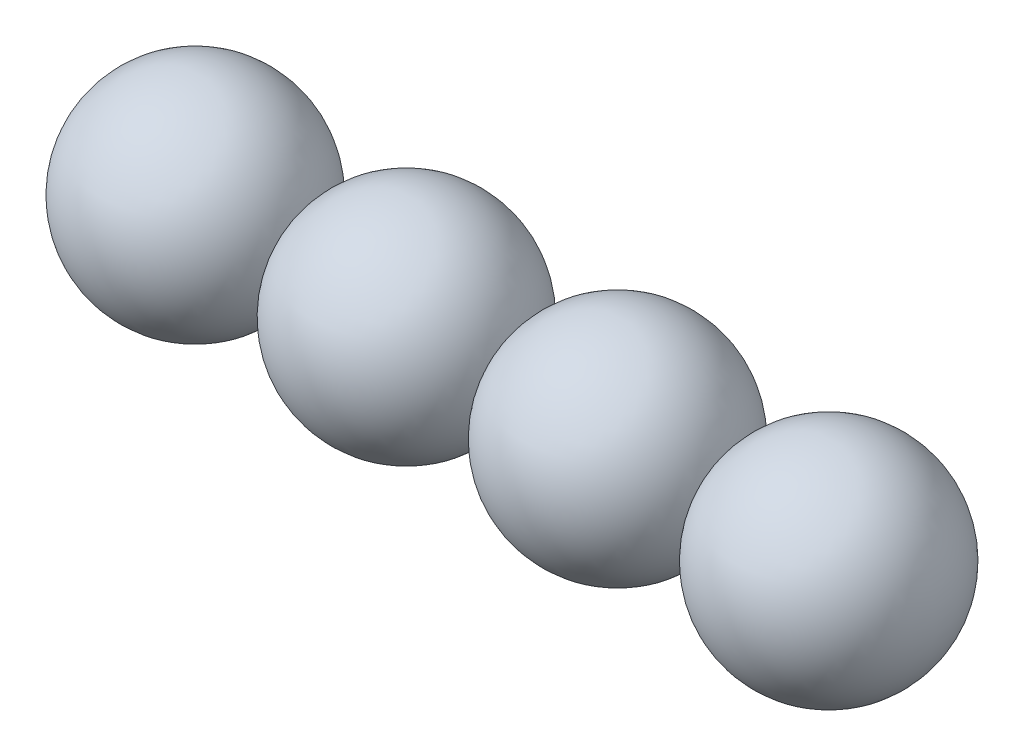
ISO-10303-21;
HEADER;
FILE_DESCRIPTION(('STEP AP214'),'2;1');
FILE_NAME('part.step','',(''),(''),'','','');
FILE_SCHEMA(('AUTOMOTIVE_DESIGN { 1 0 10303 214 1 1 1 1 }'));
ENDSEC;
DATA;
#1=APPLICATION_CONTEXT('core data for automotive mechanical design processes');
#2=APPLICATION_PROTOCOL_DEFINITION('international standard','automotive_design',2000,#1);
#3=PRODUCT_CONTEXT('',#1,'mechanical');
#4=PRODUCT('Part','Part','',(#3));
#5=PRODUCT_RELATED_PRODUCT_CATEGORY('part','',(#4));
#6=PRODUCT_DEFINITION_FORMATION('','',#4);
#7=PRODUCT_DEFINITION_CONTEXT('part definition',#1,'design');
#8=PRODUCT_DEFINITION('design','',#6,#7);
#9=PRODUCT_DEFINITION_SHAPE('','',#8);
#10=(LENGTH_UNIT() NAMED_UNIT(*) SI_UNIT(.MILLI.,.METRE.));
#11=(NAMED_UNIT(*) PLANE_ANGLE_UNIT() SI_UNIT($,.RADIAN.));
#12=(NAMED_UNIT(*) SI_UNIT($,.STERADIAN.) SOLID_ANGLE_UNIT());
#13=UNCERTAINTY_MEASURE_WITH_UNIT(LENGTH_MEASURE(1.E-05),#10,'distance_accuracy_value','');
#14=(GEOMETRIC_REPRESENTATION_CONTEXT(3) GLOBAL_UNCERTAINTY_ASSIGNED_CONTEXT((#13)) GLOBAL_UNIT_ASSIGNED_CONTEXT((#10,
#11,#12)) REPRESENTATION_CONTEXT('',''));
#15=CARTESIAN_POINT('',(0.,0.,0.));
#16=DIRECTION('',(0.,0.,1.));
#17=DIRECTION('',(1.,0.,0.));
#18=AXIS2_PLACEMENT_3D('',#15,#16,#17);
#19=CARTESIAN_POINT('',(180.,0.,0.));
#20=DIRECTION('',(0.,1.,0.));
#21=DIRECTION('',(1.,0.,0.));
#22=AXIS2_PLACEMENT_3D('',#19,#20,#21);
#23=SPHERICAL_SURFACE('',#22,30.);
#24=CARTESIAN_POINT('',(180.,30.,0.));
#25=VERTEX_POINT('',#24);
#26=VERTEX_LOOP('',#25);
#27=FACE_BOUND('',#26,.T.);
#28=ADVANCED_FACE('F40',(#27),#23,.T.);
#29=CLOSED_SHELL('',(#28));
#30=MANIFOLD_SOLID_BREP('B2',#29);
#31=CARTESIAN_POINT('',(120.,0.,0.));
#32=DIRECTION('',(0.,1.,0.));
#33=DIRECTION('',(1.,0.,0.));
#34=AXIS2_PLACEMENT_3D('',#31,#32,#33);
#35=SPHERICAL_SURFACE('',#34,30.);
#36=CARTESIAN_POINT('',(150.,0.,0.));
#37=VERTEX_POINT('',#36);
#38=VERTEX_LOOP('',#37);
#39=FACE_BOUND('',#38,.T.);
#40=ADVANCED_FACE('F59',(#39),#35,.T.);
#41=CLOSED_SHELL('',(#40));
#42=MANIFOLD_SOLID_BREP('B6',#41);
#43=CARTESIAN_POINT('',(60.,0.,0.));
#44=DIRECTION('',(0.,1.,0.));
#45=DIRECTION('',(1.,0.,0.));
#46=AXIS2_PLACEMENT_3D('',#43,#44,#45);
#47=SPHERICAL_SURFACE('',#46,30.);
#48=CARTESIAN_POINT('',(60.,30.,0.));
#49=VERTEX_POINT('',#48);
#50=VERTEX_LOOP('',#49);
#51=FACE_BOUND('',#50,.T.);
#52=ADVANCED_FACE('F77',(#51),#47,.T.);
#53=CLOSED_SHELL('',(#52));
#54=MANIFOLD_SOLID_BREP('B34',#53);
#55=CARTESIAN_POINT('',(0.,0.,0.));
#56=DIRECTION('',(0.,1.,0.));
#57=DIRECTION('',(1.,0.,0.));
#58=AXIS2_PLACEMENT_3D('',#55,#56,#57);
#59=SPHERICAL_SURFACE('',#58,30.);
#60=CARTESIAN_POINT('',(0.,30.,0.));
#61=VERTEX_POINT('',#60);
#62=VERTEX_LOOP('',#61);
#63=FACE_BOUND('',#62,.T.);
#64=ADVANCED_FACE('F90',(#63),#59,.T.);
#65=CLOSED_SHELL('',(#64));
#66=MANIFOLD_SOLID_BREP('B55',#65);
#67=ADVANCED_BREP_SHAPE_REPRESENTATION('',(#18,#30,#42,#54,#66),#14);
#68=SHAPE_DEFINITION_REPRESENTATION(#9,#67);
ENDSEC;
END-ISO-10303-21;
